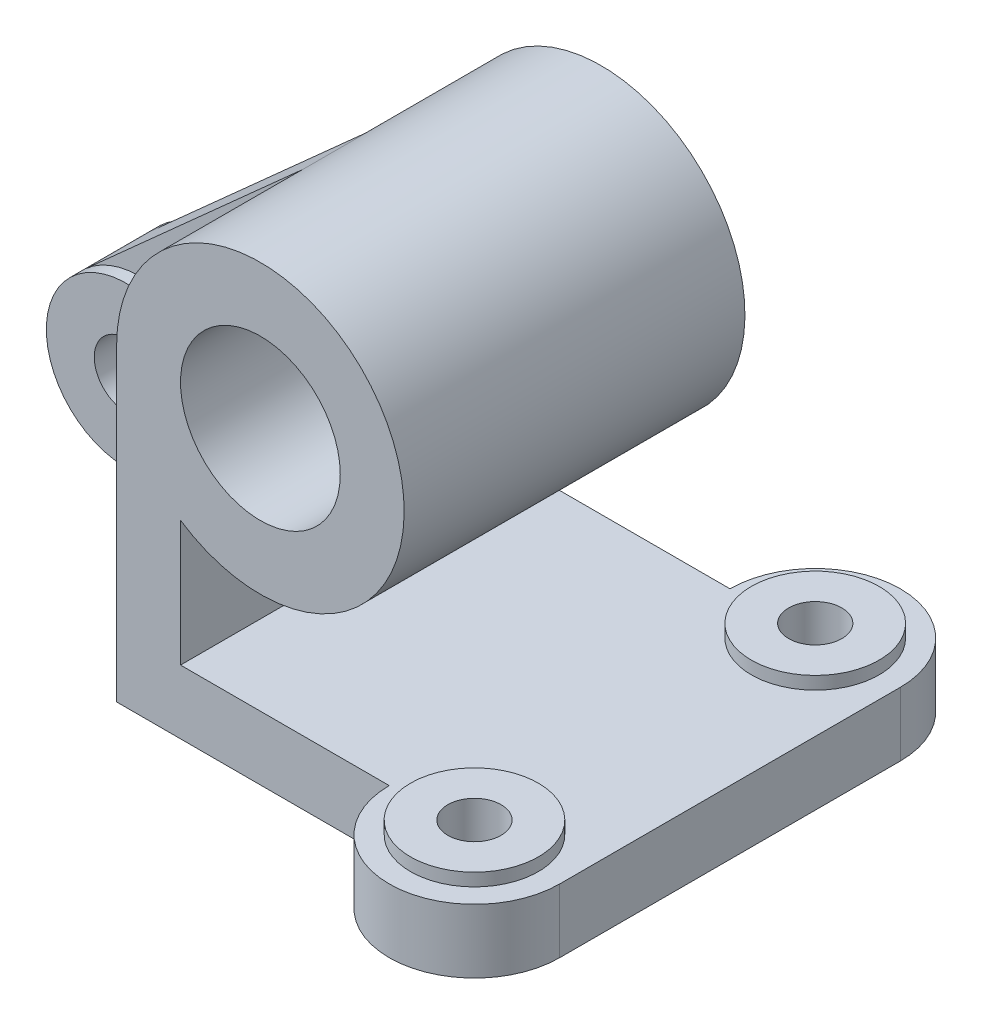
ISO-10303-21;
HEADER;
FILE_DESCRIPTION(('STEP AP214'),'2;1');
FILE_NAME('part.step','',(''),(''),'','','');
FILE_SCHEMA(('AUTOMOTIVE_DESIGN { 1 0 10303 214 1 1 1 1 }'));
ENDSEC;
DATA;
#1=APPLICATION_CONTEXT('core data for automotive mechanical design processes');
#2=APPLICATION_PROTOCOL_DEFINITION('international standard','automotive_design',2000,#1);
#3=PRODUCT_CONTEXT('',#1,'mechanical');
#4=PRODUCT('Part','Part','',(#3));
#5=PRODUCT_RELATED_PRODUCT_CATEGORY('part','',(#4));
#6=PRODUCT_DEFINITION_FORMATION('','',#4);
#7=PRODUCT_DEFINITION_CONTEXT('part definition',#1,'design');
#8=PRODUCT_DEFINITION('design','',#6,#7);
#9=PRODUCT_DEFINITION_SHAPE('','',#8);
#10=(LENGTH_UNIT() NAMED_UNIT(*) SI_UNIT(.MILLI.,.METRE.));
#11=(NAMED_UNIT(*) PLANE_ANGLE_UNIT() SI_UNIT($,.RADIAN.));
#12=(NAMED_UNIT(*) SI_UNIT($,.STERADIAN.) SOLID_ANGLE_UNIT());
#13=UNCERTAINTY_MEASURE_WITH_UNIT(LENGTH_MEASURE(1.E-05),#10,'distance_accuracy_value','');
#14=(GEOMETRIC_REPRESENTATION_CONTEXT(3) GLOBAL_UNCERTAINTY_ASSIGNED_CONTEXT((#13)) GLOBAL_UNIT_ASSIGNED_CONTEXT((#10,
#11,#12)) REPRESENTATION_CONTEXT('',''));
#15=CARTESIAN_POINT('',(0.,0.,0.));
#16=DIRECTION('',(0.,0.,1.));
#17=DIRECTION('',(1.,0.,0.));
#18=AXIS2_PLACEMENT_3D('',#15,#16,#17);
#19=CARTESIAN_POINT('',(0.,-144.998655552568,80.));
#20=DIRECTION('',(0.,1.,0.));
#21=DIRECTION('',(-1.,0.,0.));
#22=AXIS2_PLACEMENT_3D('',#19,#20,#21);
#23=PLANE('',#22);
#24=CARTESIAN_POINT('',(100.5,-144.998655552568,-80.));
#25=DIRECTION('',(0.,1.,0.));
#26=DIRECTION('',(-1.,0.,0.));
#27=AXIS2_PLACEMENT_3D('',#24,#25,#26);
#28=CIRCLE('',#27,12.5);
#29=CARTESIAN_POINT('',(88.,-144.998655552568,-80.));
#30=VERTEX_POINT('',#29);
#31=EDGE_CURVE('E351',#30,#30,#28,.T.);
#32=ORIENTED_EDGE('',*,*,#31,.T.);
#33=EDGE_LOOP('',(#32));
#34=FACE_BOUND('',#33,.T.);
#35=DIRECTION('',(1.,0.,0.));
#36=VECTOR('',#35,1.);
#37=CARTESIAN_POINT('',(0.,-144.998655552568,-80.));
#38=LINE('',#37,#36);
#39=CARTESIAN_POINT('',(-67.5,-144.998655552568,-80.));
#40=VERTEX_POINT('',#39);
#41=CARTESIAN_POINT('',(60.5,-144.998655552568,-80.));
#42=VERTEX_POINT('',#41);
#43=EDGE_CURVE('E173',#40,#42,#38,.T.);
#44=ORIENTED_EDGE('',*,*,#43,.T.);
#45=CARTESIAN_POINT('',(100.5,-144.998655552568,-80.));
#46=DIRECTION('',(0.,1.,0.));
#47=DIRECTION('',(-1.,0.,0.));
#48=AXIS2_PLACEMENT_3D('',#45,#46,#47);
#49=CIRCLE('',#48,40.);
#50=CARTESIAN_POINT('',(140.5,-144.998655552568,-80.));
#51=VERTEX_POINT('',#50);
#52=EDGE_CURVE('E160',#51,#42,#49,.T.);
#53=ORIENTED_EDGE('',*,*,#52,.F.);
#54=DIRECTION('',(0.,0.,1.));
#55=VECTOR('',#54,1.);
#56=CARTESIAN_POINT('',(140.5,-144.998655552568,80.));
#57=LINE('',#56,#55);
#58=CARTESIAN_POINT('',(140.5,-144.998655552568,80.));
#59=VERTEX_POINT('',#58);
#60=EDGE_CURVE('E154',#51,#59,#57,.T.);
#61=ORIENTED_EDGE('',*,*,#60,.T.);
#62=CARTESIAN_POINT('',(100.5,-144.998655552568,80.));
#63=DIRECTION('',(0.,1.,0.));
#64=DIRECTION('',(-1.,0.,0.));
#65=AXIS2_PLACEMENT_3D('',#62,#63,#64);
#66=CIRCLE('',#65,40.);
#67=CARTESIAN_POINT('',(60.5,-144.998655552568,80.));
#68=VERTEX_POINT('',#67);
#69=EDGE_CURVE('E316',#68,#59,#66,.T.);
#70=ORIENTED_EDGE('',*,*,#69,.F.);
#71=DIRECTION('',(1.,0.,0.));
#72=VECTOR('',#71,1.);
#73=CARTESIAN_POINT('',(0.,-144.998655552568,80.));
#74=LINE('',#73,#72);
#75=CARTESIAN_POINT('',(-67.5,-144.998655552568,80.));
#76=VERTEX_POINT('',#75);
#77=EDGE_CURVE('E69',#76,#68,#74,.T.);
#78=ORIENTED_EDGE('',*,*,#77,.F.);
#79=DIRECTION('',(0.,0.,-1.));
#80=VECTOR('',#79,1.);
#81=CARTESIAN_POINT('',(-67.5,-144.998655552568,80.));
#82=LINE('',#81,#80);
#83=CARTESIAN_POINT('',(-67.5,-144.998655552568,15.));
#84=VERTEX_POINT('',#83);
#85=EDGE_CURVE('E190',#76,#84,#82,.T.);
#86=ORIENTED_EDGE('',*,*,#85,.T.);
#87=DIRECTION('',(0.,0.,-1.));
#88=VECTOR('',#87,1.);
#89=CARTESIAN_POINT('',(-67.5,-144.998655552568,15.));
#90=LINE('',#89,#88);
#91=CARTESIAN_POINT('',(-67.5,-144.998655552568,-15.));
#92=VERTEX_POINT('',#91);
#93=EDGE_CURVE('E246',#84,#92,#90,.T.);
#94=ORIENTED_EDGE('',*,*,#93,.T.);
#95=EDGE_CURVE('E188',#92,#40,#82,.T.);
#96=ORIENTED_EDGE('',*,*,#95,.T.);
#97=EDGE_LOOP('',(#44,#53,#61,#70,#78,#86,#94,#96));
#98=FACE_BOUND('',#97,.T.);
#99=CARTESIAN_POINT('',(100.5,-144.998655552568,80.));
#100=DIRECTION('',(0.,1.,0.));
#101=DIRECTION('',(-1.,0.,0.));
#102=AXIS2_PLACEMENT_3D('',#99,#100,#101);
#103=CIRCLE('',#102,12.5);
#104=CARTESIAN_POINT('',(88.,-144.998655552568,80.));
#105=VERTEX_POINT('',#104);
#106=EDGE_CURVE('E339',#105,#105,#103,.T.);
#107=ORIENTED_EDGE('',*,*,#106,.T.);
#108=EDGE_LOOP('',(#107));
#109=FACE_BOUND('',#108,.T.);
#110=ADVANCED_FACE('F48',(#34,#98,#109),#23,.F.);
#111=CARTESIAN_POINT('',(0.,0.,80.));
#112=DIRECTION('',(0.,0.,1.));
#113=DIRECTION('',(1.,0.,0.));
#114=AXIS2_PLACEMENT_3D('',#111,#112,#113);
#115=PLANE('',#114);
#116=CARTESIAN_POINT('',(0.,0.,80.));
#117=DIRECTION('',(0.,0.,1.));
#118=DIRECTION('',(1.,0.,0.));
#119=AXIS2_PLACEMENT_3D('',#116,#117,#118);
#120=CIRCLE('',#119,37.5);
#121=CARTESIAN_POINT('',(37.5,0.,80.));
#122=VERTEX_POINT('',#121);
#123=EDGE_CURVE('E189',#122,#122,#120,.T.);
#124=ORIENTED_EDGE('',*,*,#123,.F.);
#125=EDGE_LOOP('',(#124));
#126=FACE_BOUND('',#125,.T.);
#127=ORIENTED_EDGE('',*,*,#77,.T.);
#128=DIRECTION('',(0.,-1.,0.));
#129=VECTOR('',#128,1.);
#130=CARTESIAN_POINT('',(60.5,-114.998655552568,80.));
#131=LINE('',#130,#129);
#132=CARTESIAN_POINT('',(60.5,-114.998655552568,80.));
#133=VERTEX_POINT('',#132);
#134=EDGE_CURVE('E64',#133,#68,#131,.T.);
#135=ORIENTED_EDGE('',*,*,#134,.F.);
#136=DIRECTION('',(-1.,0.,0.));
#137=VECTOR('',#136,1.);
#138=CARTESIAN_POINT('',(0.,-114.998655552568,80.));
#139=LINE('',#138,#137);
#140=CARTESIAN_POINT('',(-37.5,-114.998655552568,80.));
#141=VERTEX_POINT('',#140);
#142=EDGE_CURVE('E229',#133,#141,#139,.T.);
#143=ORIENTED_EDGE('',*,*,#142,.T.);
#144=DIRECTION('',(0.,1.,0.));
#145=VECTOR('',#144,1.);
#146=CARTESIAN_POINT('',(-37.5,0.,80.));
#147=LINE('',#146,#145);
#148=CARTESIAN_POINT('',(-37.5,-56.1248608016091,80.));
#149=VERTEX_POINT('',#148);
#150=EDGE_CURVE('E179',#141,#149,#147,.T.);
#151=ORIENTED_EDGE('',*,*,#150,.T.);
#152=CARTESIAN_POINT('',(0.,0.,80.));
#153=DIRECTION('',(0.,0.,1.));
#154=DIRECTION('',(1.,0.,0.));
#155=AXIS2_PLACEMENT_3D('',#152,#153,#154);
#156=CIRCLE('',#155,67.5);
#157=CARTESIAN_POINT('',(-67.5,0.,80.));
#158=VERTEX_POINT('',#157);
#159=EDGE_CURVE('E237',#149,#158,#156,.T.);
#160=ORIENTED_EDGE('',*,*,#159,.T.);
#161=DIRECTION('',(0.,-1.,0.));
#162=VECTOR('',#161,1.);
#163=CARTESIAN_POINT('',(-67.5,0.,80.));
#164=LINE('',#163,#162);
#165=EDGE_CURVE('E234',#158,#76,#164,.T.);
#166=ORIENTED_EDGE('',*,*,#165,.T.);
#167=EDGE_LOOP('',(#127,#135,#143,#151,#160,#166));
#168=FACE_BOUND('',#167,.T.);
#169=ADVANCED_FACE('F374',(#126,#168),#115,.T.);
#170=CARTESIAN_POINT('',(0.,0.,-80.));
#171=DIRECTION('',(0.,0.,1.));
#172=DIRECTION('',(1.,0.,0.));
#173=AXIS2_PLACEMENT_3D('',#170,#171,#172);
#174=PLANE('',#173);
#175=CARTESIAN_POINT('',(0.,0.,-80.));
#176=DIRECTION('',(0.,0.,1.));
#177=DIRECTION('',(1.,0.,0.));
#178=AXIS2_PLACEMENT_3D('',#175,#176,#177);
#179=CIRCLE('',#178,37.5);
#180=CARTESIAN_POINT('',(37.5,0.,-80.));
#181=VERTEX_POINT('',#180);
#182=EDGE_CURVE('E172',#181,#181,#179,.T.);
#183=ORIENTED_EDGE('',*,*,#182,.T.);
#184=EDGE_LOOP('',(#183));
#185=FACE_BOUND('',#184,.T.);
#186=DIRECTION('',(0.,-1.,0.));
#187=VECTOR('',#186,1.);
#188=CARTESIAN_POINT('',(60.5,-114.998655552568,-80.));
#189=LINE('',#188,#187);
#190=CARTESIAN_POINT('',(60.5,-114.998655552568,-80.));
#191=VERTEX_POINT('',#190);
#192=EDGE_CURVE('E157',#191,#42,#189,.T.);
#193=ORIENTED_EDGE('',*,*,#192,.T.);
#194=ORIENTED_EDGE('',*,*,#43,.F.);
#195=DIRECTION('',(0.,-1.,0.));
#196=VECTOR('',#195,1.);
#197=CARTESIAN_POINT('',(-67.5,0.,-80.));
#198=LINE('',#197,#196);
#199=CARTESIAN_POINT('',(-67.5,0.,-80.));
#200=VERTEX_POINT('',#199);
#201=EDGE_CURVE('E181',#200,#40,#198,.T.);
#202=ORIENTED_EDGE('',*,*,#201,.F.);
#203=CARTESIAN_POINT('',(0.,0.,-80.));
#204=DIRECTION('',(0.,0.,1.));
#205=DIRECTION('',(1.,0.,0.));
#206=AXIS2_PLACEMENT_3D('',#203,#204,#205);
#207=CIRCLE('',#206,67.5);
#208=CARTESIAN_POINT('',(-37.5,-56.1248608016091,-80.));
#209=VERTEX_POINT('',#208);
#210=EDGE_CURVE('E214',#209,#200,#207,.T.);
#211=ORIENTED_EDGE('',*,*,#210,.F.);
#212=DIRECTION('',(0.,1.,0.));
#213=VECTOR('',#212,1.);
#214=CARTESIAN_POINT('',(-37.5,0.,-80.));
#215=LINE('',#214,#213);
#216=CARTESIAN_POINT('',(-37.5,-114.998655552568,-80.));
#217=VERTEX_POINT('',#216);
#218=EDGE_CURVE('E170',#217,#209,#215,.T.);
#219=ORIENTED_EDGE('',*,*,#218,.F.);
#220=DIRECTION('',(-1.,0.,0.));
#221=VECTOR('',#220,1.);
#222=CARTESIAN_POINT('',(0.,-114.998655552568,-80.));
#223=LINE('',#222,#221);
#224=EDGE_CURVE('E147',#191,#217,#223,.T.);
#225=ORIENTED_EDGE('',*,*,#224,.F.);
#226=EDGE_LOOP('',(#193,#194,#202,#211,#219,#225));
#227=FACE_BOUND('',#226,.T.);
#228=ADVANCED_FACE('F168',(#185,#227),#174,.F.);
#229=CARTESIAN_POINT('',(-67.5,0.,80.));
#230=DIRECTION('',(1.,0.,0.));
#231=DIRECTION('',(0.,1.,0.));
#232=AXIS2_PLACEMENT_3D('',#229,#230,#231);
#233=PLANE('',#232);
#234=DIRECTION('',(0.,-1.,0.));
#235=VECTOR('',#234,1.);
#236=CARTESIAN_POINT('',(-67.5,0.,-15.));
#237=LINE('',#236,#235);
#238=CARTESIAN_POINT('',(-67.5,0.,-15.));
#239=VERTEX_POINT('',#238);
#240=EDGE_CURVE('E211',#239,#92,#237,.T.);
#241=ORIENTED_EDGE('',*,*,#240,.F.);
#242=DIRECTION('',(0.,0.,-1.));
#243=VECTOR('',#242,1.);
#244=CARTESIAN_POINT('',(-67.5,0.,80.));
#245=LINE('',#244,#243);
#246=EDGE_CURVE('E193',#239,#200,#245,.T.);
#247=ORIENTED_EDGE('',*,*,#246,.T.);
#248=ORIENTED_EDGE('',*,*,#201,.T.);
#249=ORIENTED_EDGE('',*,*,#95,.F.);
#250=EDGE_LOOP('',(#241,#247,#248,#249));
#251=FACE_BOUND('',#250,.T.);
#252=ADVANCED_FACE('F208',(#251),#233,.F.);
#253=CARTESIAN_POINT('',(-37.5,0.,80.));
#254=DIRECTION('',(-1.,0.,0.));
#255=DIRECTION('',(0.,-1.,0.));
#256=AXIS2_PLACEMENT_3D('',#253,#254,#255);
#257=PLANE('',#256);
#258=ORIENTED_EDGE('',*,*,#218,.T.);
#259=DIRECTION('',(0.,0.,-1.));
#260=VECTOR('',#259,1.);
#261=CARTESIAN_POINT('',(-37.5,-56.1248608016091,80.));
#262=LINE('',#261,#260);
#263=EDGE_CURVE('E12',#149,#209,#262,.T.);
#264=ORIENTED_EDGE('',*,*,#263,.F.);
#265=ORIENTED_EDGE('',*,*,#150,.F.);
#266=DIRECTION('',(0.,0.,-1.));
#267=VECTOR('',#266,1.);
#268=CARTESIAN_POINT('',(-37.5,-114.998655552568,80.));
#269=LINE('',#268,#267);
#270=EDGE_CURVE('E185',#141,#217,#269,.T.);
#271=ORIENTED_EDGE('',*,*,#270,.T.);
#272=EDGE_LOOP('',(#258,#264,#265,#271));
#273=FACE_BOUND('',#272,.T.);
#274=ADVANCED_FACE('F50',(#273),#257,.F.);
#275=CARTESIAN_POINT('',(0.,0.,80.));
#276=DIRECTION('',(0.,0.,-1.));
#277=DIRECTION('',(-1.,0.,0.));
#278=AXIS2_PLACEMENT_3D('',#275,#276,#277);
#279=CYLINDRICAL_SURFACE('',#278,67.5);
#280=DIRECTION('',(0.,0.,-1.));
#281=VECTOR('',#280,1.);
#282=CARTESIAN_POINT('',(-45.0349803120584,50.2802202490453,15.));
#283=LINE('',#282,#281);
#284=CARTESIAN_POINT('',(-45.0349803120584,50.2802202490453,15.));
#285=VERTEX_POINT('',#284);
#286=CARTESIAN_POINT('',(-45.0349803120584,50.2802202490453,-15.));
#287=VERTEX_POINT('',#286);
#288=EDGE_CURVE('E250',#285,#287,#283,.T.);
#289=ORIENTED_EDGE('',*,*,#288,.F.);
#290=CARTESIAN_POINT('',(0.,0.,15.));
#291=DIRECTION('',(0.,0.,1.));
#292=DIRECTION('',(1.,0.,0.));
#293=AXIS2_PLACEMENT_3D('',#290,#291,#292);
#294=CIRCLE('',#293,67.5);
#295=CARTESIAN_POINT('',(-67.5,0.,15.));
#296=VERTEX_POINT('',#295);
#297=EDGE_CURVE('E279',#285,#296,#294,.T.);
#298=ORIENTED_EDGE('',*,*,#297,.T.);
#299=EDGE_CURVE('E57',#158,#296,#245,.T.);
#300=ORIENTED_EDGE('',*,*,#299,.F.);
#301=ORIENTED_EDGE('',*,*,#159,.F.);
#302=ORIENTED_EDGE('',*,*,#263,.T.);
#303=ORIENTED_EDGE('',*,*,#210,.T.);
#304=ORIENTED_EDGE('',*,*,#246,.F.);
#305=CARTESIAN_POINT('',(0.,0.,-15.));
#306=DIRECTION('',(0.,0.,1.));
#307=DIRECTION('',(1.,0.,0.));
#308=AXIS2_PLACEMENT_3D('',#305,#306,#307);
#309=CIRCLE('',#308,67.5);
#310=EDGE_CURVE('E262',#287,#239,#309,.T.);
#311=ORIENTED_EDGE('',*,*,#310,.F.);
#312=EDGE_LOOP('',(#289,#298,#300,#301,#302,#303,#304,#311));
#313=FACE_BOUND('',#312,.T.);
#314=ADVANCED_FACE('F216',(#313),#279,.T.);
#315=ORIENTED_EDGE('',*,*,#299,.T.);
#316=DIRECTION('',(0.,-1.,0.));
#317=VECTOR('',#316,1.);
#318=CARTESIAN_POINT('',(-67.5,0.,15.));
#319=LINE('',#318,#317);
#320=EDGE_CURVE('E283',#296,#84,#319,.T.);
#321=ORIENTED_EDGE('',*,*,#320,.T.);
#322=ORIENTED_EDGE('',*,*,#85,.F.);
#323=ORIENTED_EDGE('',*,*,#165,.F.);
#324=EDGE_LOOP('',(#315,#321,#322,#323));
#325=FACE_BOUND('',#324,.T.);
#326=ADVANCED_FACE('F386',(#325),#233,.F.);
#327=CARTESIAN_POINT('',(0.,-114.998655552568,80.));
#328=DIRECTION('',(0.,-1.,0.));
#329=DIRECTION('',(1.,0.,0.));
#330=AXIS2_PLACEMENT_3D('',#327,#328,#329);
#331=PLANE('',#330);
#332=CARTESIAN_POINT('',(100.5,-114.998655552568,-80.));
#333=DIRECTION('',(0.,1.,0.));
#334=DIRECTION('',(-1.,0.,0.));
#335=AXIS2_PLACEMENT_3D('',#332,#333,#334);
#336=CIRCLE('',#335,30.);
#337=CARTESIAN_POINT('',(70.5,-114.998655552568,-80.));
#338=VERTEX_POINT('',#337);
#339=EDGE_CURVE('E153',#338,#338,#336,.T.);
#340=ORIENTED_EDGE('',*,*,#339,.F.);
#341=EDGE_LOOP('',(#340));
#342=FACE_BOUND('',#341,.T.);
#343=CARTESIAN_POINT('',(100.5,-114.998655552568,80.));
#344=DIRECTION('',(0.,1.,0.));
#345=DIRECTION('',(-1.,0.,0.));
#346=AXIS2_PLACEMENT_3D('',#343,#344,#345);
#347=CIRCLE('',#346,30.);
#348=CARTESIAN_POINT('',(70.5,-114.998655552568,80.));
#349=VERTEX_POINT('',#348);
#350=EDGE_CURVE('E328',#349,#349,#347,.T.);
#351=ORIENTED_EDGE('',*,*,#350,.F.);
#352=EDGE_LOOP('',(#351));
#353=FACE_BOUND('',#352,.T.);
#354=ORIENTED_EDGE('',*,*,#142,.F.);
#355=CARTESIAN_POINT('',(100.5,-114.998655552568,80.));
#356=DIRECTION('',(0.,1.,0.));
#357=DIRECTION('',(-1.,0.,0.));
#358=AXIS2_PLACEMENT_3D('',#355,#356,#357);
#359=CIRCLE('',#358,40.);
#360=CARTESIAN_POINT('',(140.5,-114.998655552568,80.));
#361=VERTEX_POINT('',#360);
#362=EDGE_CURVE('E325',#133,#361,#359,.T.);
#363=ORIENTED_EDGE('',*,*,#362,.T.);
#364=DIRECTION('',(0.,0.,1.));
#365=VECTOR('',#364,1.);
#366=CARTESIAN_POINT('',(140.5,-114.998655552568,80.));
#367=LINE('',#366,#365);
#368=CARTESIAN_POINT('',(140.5,-114.998655552568,-80.));
#369=VERTEX_POINT('',#368);
#370=EDGE_CURVE('E150',#369,#361,#367,.T.);
#371=ORIENTED_EDGE('',*,*,#370,.F.);
#372=CARTESIAN_POINT('',(100.5,-114.998655552568,-80.));
#373=DIRECTION('',(0.,1.,0.));
#374=DIRECTION('',(-1.,0.,0.));
#375=AXIS2_PLACEMENT_3D('',#372,#373,#374);
#376=CIRCLE('',#375,40.);
#377=EDGE_CURVE('E142',#369,#191,#376,.T.);
#378=ORIENTED_EDGE('',*,*,#377,.T.);
#379=ORIENTED_EDGE('',*,*,#224,.T.);
#380=ORIENTED_EDGE('',*,*,#270,.F.);
#381=EDGE_LOOP('',(#354,#363,#371,#378,#379,#380));
#382=FACE_BOUND('',#381,.T.);
#383=ADVANCED_FACE('F144',(#342,#353,#382),#331,.F.);
#384=CARTESIAN_POINT('',(0.,0.,80.));
#385=DIRECTION('',(0.,0.,-1.));
#386=DIRECTION('',(-1.,0.,0.));
#387=AXIS2_PLACEMENT_3D('',#384,#385,#386);
#388=CYLINDRICAL_SURFACE('',#387,37.5);
#389=ORIENTED_EDGE('',*,*,#123,.T.);
#390=EDGE_LOOP('',(#389));
#391=FACE_BOUND('',#390,.T.);
#392=ORIENTED_EDGE('',*,*,#182,.F.);
#393=EDGE_LOOP('',(#392));
#394=FACE_BOUND('',#393,.T.);
#395=ADVANCED_FACE('F466',(#391,#394),#388,.F.);
#396=CARTESIAN_POINT('',(-81.2836413694165,-136.809264537074,15.));
#397=DIRECTION('',(0.510785627799753,0.859708114672191,0.));
#398=DIRECTION('',(-0.859708114672191,0.510785627799753,0.));
#399=AXIS2_PLACEMENT_3D('',#396,#397,#398);
#400=PLANE('',#399);
#401=DIRECTION('',(0.859708114672191,-0.510785627799753,0.));
#402=VECTOR('',#401,1.);
#403=CARTESIAN_POINT('',(-81.2836413694165,-136.809264537074,-15.));
#404=LINE('',#403,#402);
#405=CARTESIAN_POINT('',(-141.154461042491,-101.237709852775,-15.));
#406=VERTEX_POINT('',#405);
#407=EDGE_CURVE('E267',#406,#92,#404,.T.);
#408=ORIENTED_EDGE('',*,*,#407,.T.);
#409=ORIENTED_EDGE('',*,*,#93,.F.);
#410=DIRECTION('',(0.859708114672191,-0.510785627799753,0.));
#411=VECTOR('',#410,1.);
#412=CARTESIAN_POINT('',(-81.2836413694165,-136.809264537074,15.));
#413=LINE('',#412,#411);
#414=CARTESIAN_POINT('',(-141.154461042491,-101.237709852775,15.));
#415=VERTEX_POINT('',#414);
#416=EDGE_CURVE('E286',#415,#84,#413,.T.);
#417=ORIENTED_EDGE('',*,*,#416,.F.);
#418=DIRECTION('',(0.,0.,-1.));
#419=VECTOR('',#418,1.);
#420=CARTESIAN_POINT('',(-141.154461042491,-101.237709852775,15.));
#421=LINE('',#420,#419);
#422=EDGE_CURVE('E225',#415,#406,#421,.T.);
#423=ORIENTED_EDGE('',*,*,#422,.T.);
#424=EDGE_LOOP('',(#408,#409,#417,#423));
#425=FACE_BOUND('',#424,.T.);
#426=ADVANCED_FACE('F421',(#425),#400,.F.);
#427=CARTESIAN_POINT('',(-45.0349803120584,50.2802202490453,15.));
#428=DIRECTION('',(-0.667184893511977,0.744892151837709,0.));
#429=DIRECTION('',(-0.744892151837709,-0.667184893511977,0.));
#430=AXIS2_PLACEMENT_3D('',#427,#428,#429);
#431=PLANE('',#430);
#432=DIRECTION('',(0.744892151837709,0.667184893511977,0.));
#433=VECTOR('',#432,1.);
#434=CARTESIAN_POINT('',(-45.0349803120584,50.2802202490453,-15.));
#435=LINE('',#434,#433);
#436=CARTESIAN_POINT('',(-147.019433506699,-41.0651998586538,-15.));
#437=VERTEX_POINT('',#436);
#438=EDGE_CURVE('E257',#437,#287,#435,.T.);
#439=ORIENTED_EDGE('',*,*,#438,.F.);
#440=DIRECTION('',(0.,0.,-1.));
#441=VECTOR('',#440,1.);
#442=CARTESIAN_POINT('',(-147.019433506699,-41.0651998586538,15.));
#443=LINE('',#442,#441);
#444=CARTESIAN_POINT('',(-147.019433506699,-41.0651998586538,15.));
#445=VERTEX_POINT('',#444);
#446=EDGE_CURVE('E253',#445,#437,#443,.T.);
#447=ORIENTED_EDGE('',*,*,#446,.F.);
#448=DIRECTION('',(0.744892151837709,0.667184893511977,0.));
#449=VECTOR('',#448,1.);
#450=CARTESIAN_POINT('',(-45.0349803120584,50.2802202490453,15.));
#451=LINE('',#450,#449);
#452=EDGE_CURVE('E256',#445,#285,#451,.T.);
#453=ORIENTED_EDGE('',*,*,#452,.T.);
#454=ORIENTED_EDGE('',*,*,#288,.T.);
#455=EDGE_LOOP('',(#439,#447,#453,#454));
#456=FACE_BOUND('',#455,.T.);
#457=ADVANCED_FACE('F429',(#456),#431,.T.);
#458=CARTESIAN_POINT('',(0.,0.,15.));
#459=DIRECTION('',(0.,0.,1.));
#460=DIRECTION('',(1.,0.,0.));
#461=AXIS2_PLACEMENT_3D('',#458,#459,#460);
#462=PLANE('',#461);
#463=CARTESIAN_POINT('',(-122.,-68.9986555525679,15.));
#464=DIRECTION('',(0.,0.,1.));
#465=DIRECTION('',(1.,0.,0.));
#466=AXIS2_PLACEMENT_3D('',#463,#464,#465);
#467=CIRCLE('',#466,37.5);
#468=EDGE_CURVE('E261',#415,#445,#467,.T.);
#469=ORIENTED_EDGE('',*,*,#468,.F.);
#470=ORIENTED_EDGE('',*,*,#416,.T.);
#471=ORIENTED_EDGE('',*,*,#320,.F.);
#472=ORIENTED_EDGE('',*,*,#297,.F.);
#473=ORIENTED_EDGE('',*,*,#452,.F.);
#474=EDGE_LOOP('',(#469,#470,#471,#472,#473));
#475=FACE_BOUND('',#474,.T.);
#476=ADVANCED_FACE('F425',(#475),#462,.T.);
#477=CARTESIAN_POINT('',(0.,0.,-15.));
#478=DIRECTION('',(0.,0.,1.));
#479=DIRECTION('',(1.,0.,0.));
#480=AXIS2_PLACEMENT_3D('',#477,#478,#479);
#481=PLANE('',#480);
#482=CARTESIAN_POINT('',(-122.,-68.9986555525679,-15.));
#483=DIRECTION('',(0.,0.,1.));
#484=DIRECTION('',(1.,0.,0.));
#485=AXIS2_PLACEMENT_3D('',#482,#483,#484);
#486=CIRCLE('',#485,37.5);
#487=EDGE_CURVE('E271',#406,#437,#486,.T.);
#488=ORIENTED_EDGE('',*,*,#487,.T.);
#489=ORIENTED_EDGE('',*,*,#438,.T.);
#490=ORIENTED_EDGE('',*,*,#310,.T.);
#491=ORIENTED_EDGE('',*,*,#240,.T.);
#492=ORIENTED_EDGE('',*,*,#407,.F.);
#493=EDGE_LOOP('',(#488,#489,#490,#491,#492));
#494=FACE_BOUND('',#493,.T.);
#495=ADVANCED_FACE('F432',(#494),#481,.F.);
#496=CARTESIAN_POINT('',(-122.,-68.9986555525679,21.));
#497=DIRECTION('',(0.,0.,-1.));
#498=DIRECTION('',(-1.,0.,0.));
#499=AXIS2_PLACEMENT_3D('',#496,#497,#498);
#500=CYLINDRICAL_SURFACE('',#499,15.);
#501=CARTESIAN_POINT('',(-122.,-68.9986555525679,21.));
#502=DIRECTION('',(0.,0.,1.));
#503=DIRECTION('',(1.,0.,0.));
#504=AXIS2_PLACEMENT_3D('',#501,#502,#503);
#505=CIRCLE('',#504,15.);
#506=CARTESIAN_POINT('',(-137.,-68.9986555525679,21.));
#507=VERTEX_POINT('',#506);
#508=EDGE_CURVE('E295',#507,#507,#505,.T.);
#509=CARTESIAN_POINT('',(-122.,-68.9986555525679,-21.));
#510=DIRECTION('',(0.,0.,1.));
#511=DIRECTION('',(1.,0.,0.));
#512=AXIS2_PLACEMENT_3D('',#509,#510,#511);
#513=CIRCLE('',#512,15.);
#514=CARTESIAN_POINT('',(-137.,-68.9986555525679,-21.));
#515=VERTEX_POINT('',#514);
#516=EDGE_CURVE('E165',#515,#515,#513,.T.);
#517=CARTESIAN_POINT('',(-137.,-68.9986555525679,21.));
#518=CARTESIAN_POINT('',(-137.,-68.9986555525679,20.5625));
#519=CARTESIAN_POINT('',(-137.,-68.9986555525679,20.125));
#520=CARTESIAN_POINT('',(-137.,-68.9986555525679,19.25));
#521=CARTESIAN_POINT('',(-137.,-68.9986555525679,18.8125));
#522=CARTESIAN_POINT('',(-137.,-68.9986555525679,17.9375));
#523=CARTESIAN_POINT('',(-137.,-68.9986555525679,17.5));
#524=CARTESIAN_POINT('',(-137.,-68.9986555525679,16.625));
#525=CARTESIAN_POINT('',(-137.,-68.9986555525679,16.1875));
#526=CARTESIAN_POINT('',(-137.,-68.9986555525679,15.3125));
#527=CARTESIAN_POINT('',(-137.,-68.9986555525679,14.875));
#528=CARTESIAN_POINT('',(-137.,-68.9986555525679,14.));
#529=CARTESIAN_POINT('',(-137.,-68.9986555525679,13.5625));
#530=CARTESIAN_POINT('',(-137.,-68.9986555525679,12.6875));
#531=CARTESIAN_POINT('',(-137.,-68.9986555525679,12.25));
#532=CARTESIAN_POINT('',(-137.,-68.9986555525679,11.375));
#533=CARTESIAN_POINT('',(-137.,-68.9986555525679,10.9375));
#534=CARTESIAN_POINT('',(-137.,-68.9986555525679,10.0625));
#535=CARTESIAN_POINT('',(-137.,-68.9986555525679,9.625));
#536=CARTESIAN_POINT('',(-137.,-68.9986555525679,8.75));
#537=CARTESIAN_POINT('',(-137.,-68.9986555525679,8.3125));
#538=CARTESIAN_POINT('',(-137.,-68.9986555525679,7.4375));
#539=CARTESIAN_POINT('',(-137.,-68.9986555525679,7.));
#540=CARTESIAN_POINT('',(-137.,-68.9986555525679,6.125));
#541=CARTESIAN_POINT('',(-137.,-68.9986555525679,5.6875));
#542=CARTESIAN_POINT('',(-137.,-68.9986555525679,4.8125));
#543=CARTESIAN_POINT('',(-137.,-68.9986555525679,4.375));
#544=CARTESIAN_POINT('',(-137.,-68.9986555525679,3.5));
#545=CARTESIAN_POINT('',(-137.,-68.9986555525679,3.0625));
#546=CARTESIAN_POINT('',(-137.,-68.9986555525679,2.1875));
#547=CARTESIAN_POINT('',(-137.,-68.9986555525679,1.75));
#548=CARTESIAN_POINT('',(-137.,-68.9986555525679,0.874999999999997));
#549=CARTESIAN_POINT('',(-137.,-68.9986555525679,0.437499999999997));
#550=CARTESIAN_POINT('',(-137.,-68.9986555525679,-0.437500000000004));
#551=CARTESIAN_POINT('',(-137.,-68.9986555525679,-0.875000000000004));
#552=CARTESIAN_POINT('',(-137.,-68.9986555525679,-1.75000000000001));
#553=CARTESIAN_POINT('',(-137.,-68.9986555525679,-2.18750000000001));
#554=CARTESIAN_POINT('',(-137.,-68.9986555525679,-3.0625));
#555=CARTESIAN_POINT('',(-137.,-68.9986555525679,-3.5));
#556=CARTESIAN_POINT('',(-137.,-68.9986555525679,-4.375));
#557=CARTESIAN_POINT('',(-137.,-68.9986555525679,-4.8125));
#558=CARTESIAN_POINT('',(-137.,-68.9986555525679,-5.68750000000001));
#559=CARTESIAN_POINT('',(-137.,-68.9986555525679,-6.12500000000001));
#560=CARTESIAN_POINT('',(-137.,-68.9986555525679,-7.00000000000001));
#561=CARTESIAN_POINT('',(-137.,-68.9986555525679,-7.4375));
#562=CARTESIAN_POINT('',(-137.,-68.9986555525679,-8.3125));
#563=CARTESIAN_POINT('',(-137.,-68.9986555525679,-8.75));
#564=CARTESIAN_POINT('',(-137.,-68.9986555525679,-9.625));
#565=CARTESIAN_POINT('',(-137.,-68.9986555525679,-10.0625));
#566=CARTESIAN_POINT('',(-137.,-68.9986555525679,-10.9375));
#567=CARTESIAN_POINT('',(-137.,-68.9986555525679,-11.375));
#568=CARTESIAN_POINT('',(-137.,-68.9986555525679,-12.25));
#569=CARTESIAN_POINT('',(-137.,-68.9986555525679,-12.6875));
#570=CARTESIAN_POINT('',(-137.,-68.9986555525679,-13.5625));
#571=CARTESIAN_POINT('',(-137.,-68.9986555525679,-14.));
#572=CARTESIAN_POINT('',(-137.,-68.9986555525679,-14.875));
#573=CARTESIAN_POINT('',(-137.,-68.9986555525679,-15.3125));
#574=CARTESIAN_POINT('',(-137.,-68.9986555525679,-16.1875));
#575=CARTESIAN_POINT('',(-137.,-68.9986555525679,-16.625));
#576=CARTESIAN_POINT('',(-137.,-68.9986555525679,-17.5));
#577=CARTESIAN_POINT('',(-137.,-68.9986555525679,-17.9375));
#578=CARTESIAN_POINT('',(-137.,-68.9986555525679,-18.8125));
#579=CARTESIAN_POINT('',(-137.,-68.9986555525679,-19.25));
#580=CARTESIAN_POINT('',(-137.,-68.9986555525679,-20.125));
#581=CARTESIAN_POINT('',(-137.,-68.9986555525679,-20.5625));
#582=CARTESIAN_POINT('',(-137.,-68.9986555525679,-21.));
#583=B_SPLINE_CURVE_WITH_KNOTS('',3,(#517,#518,#519,#520,#521,#522,#523,#524,#525,#526,#527,
#528,#529,#530,#531,#532,#533,#534,#535,#536,#537,#538,#539,#540,#541,#542,#543,#544,#545,#546,
#547,#548,#549,#550,#551,#552,#553,#554,#555,#556,#557,#558,#559,#560,#561,#562,#563,#564,#565,
#566,#567,#568,#569,#570,#571,#572,#573,#574,#575,#576,#577,#578,#579,#580,#581,#582),
.UNSPECIFIED.,.F.,.F.,(4,2,2,2,2,2,2,2,2,2,2,2,2,2,2,2,2,2,2,2,2,2,2,2,2,2,2,2,2,2,2,2,4),(0.,
1.3125,2.625,3.9375,5.25,6.5625,7.875,9.1875,10.5,11.8125,13.125,14.4375,15.75,17.0625,18.375,
19.6875,21.,22.3125,23.625,24.9375,26.25,27.5625,28.875,30.1875,31.5,32.8125,34.125,35.4375,
36.75,38.0625,39.375,40.6875,42.),.UNSPECIFIED.);
#584=EDGE_CURVE('BSEAM438',#507,#515,#583,.T.);
#585=ORIENTED_EDGE('',*,*,#508,.T.);
#586=ORIENTED_EDGE('',*,*,#516,.F.);
#587=ORIENTED_EDGE('',*,*,#584,.T.);
#588=ORIENTED_EDGE('',*,*,#584,.F.);
#589=EDGE_LOOP('',(#585,#587,#586,#588));
#590=FACE_BOUND('',#589,.T.);
#591=ADVANCED_FACE('F438',(#590),#500,.F.);
#592=CARTESIAN_POINT('',(-122.,-68.9986555525679,21.));
#593=DIRECTION('',(0.,0.,-1.));
#594=DIRECTION('',(-1.,0.,0.));
#595=AXIS2_PLACEMENT_3D('',#592,#593,#594);
#596=CYLINDRICAL_SURFACE('',#595,37.5);
#597=ORIENTED_EDGE('',*,*,#468,.T.);
#598=ORIENTED_EDGE('',*,*,#446,.T.);
#599=ORIENTED_EDGE('',*,*,#487,.F.);
#600=ORIENTED_EDGE('',*,*,#422,.F.);
#601=EDGE_LOOP('',(#597,#598,#599,#600));
#602=FACE_BOUND('',#601,.T.);
#603=CARTESIAN_POINT('',(-122.,-68.9986555525679,21.));
#604=DIRECTION('',(0.,0.,1.));
#605=DIRECTION('',(1.,0.,0.));
#606=AXIS2_PLACEMENT_3D('',#603,#604,#605);
#607=CIRCLE('',#606,37.5);
#608=CARTESIAN_POINT('',(-84.5,-68.9986555525679,21.));
#609=VERTEX_POINT('',#608);
#610=EDGE_CURVE('E275',#609,#609,#607,.T.);
#611=ORIENTED_EDGE('',*,*,#610,.F.);
#612=EDGE_LOOP('',(#611));
#613=FACE_BOUND('',#612,.T.);
#614=CARTESIAN_POINT('',(-122.,-68.9986555525679,-21.));
#615=DIRECTION('',(0.,0.,1.));
#616=DIRECTION('',(1.,0.,0.));
#617=AXIS2_PLACEMENT_3D('',#614,#615,#616);
#618=CIRCLE('',#617,37.5);
#619=CARTESIAN_POINT('',(-84.5,-68.9986555525679,-21.));
#620=VERTEX_POINT('',#619);
#621=EDGE_CURVE('E291',#620,#620,#618,.T.);
#622=ORIENTED_EDGE('',*,*,#621,.T.);
#623=EDGE_LOOP('',(#622));
#624=FACE_BOUND('',#623,.T.);
#625=ADVANCED_FACE('F434',(#602,#613,#624),#596,.T.);
#626=CARTESIAN_POINT('',(0.,0.,21.));
#627=DIRECTION('',(0.,0.,1.));
#628=DIRECTION('',(1.,0.,0.));
#629=AXIS2_PLACEMENT_3D('',#626,#627,#628);
#630=PLANE('',#629);
#631=ORIENTED_EDGE('',*,*,#508,.F.);
#632=EDGE_LOOP('',(#631));
#633=FACE_BOUND('',#632,.T.);
#634=ORIENTED_EDGE('',*,*,#610,.T.);
#635=EDGE_LOOP('',(#634));
#636=FACE_BOUND('',#635,.T.);
#637=ADVANCED_FACE('F437',(#633,#636),#630,.T.);
#638=CARTESIAN_POINT('',(0.,0.,-21.));
#639=DIRECTION('',(0.,0.,1.));
#640=DIRECTION('',(1.,0.,0.));
#641=AXIS2_PLACEMENT_3D('',#638,#639,#640);
#642=PLANE('',#641);
#643=ORIENTED_EDGE('',*,*,#516,.T.);
#644=EDGE_LOOP('',(#643));
#645=FACE_BOUND('',#644,.T.);
#646=ORIENTED_EDGE('',*,*,#621,.F.);
#647=EDGE_LOOP('',(#646));
#648=FACE_BOUND('',#647,.T.);
#649=ADVANCED_FACE('F444',(#645,#648),#642,.F.);
#650=CARTESIAN_POINT('',(100.5,-114.998655552568,-80.));
#651=DIRECTION('',(0.,-1.,0.));
#652=DIRECTION('',(1.,0.,0.));
#653=AXIS2_PLACEMENT_3D('',#650,#651,#652);
#654=CYLINDRICAL_SURFACE('',#653,40.);
#655=ORIENTED_EDGE('',*,*,#52,.T.);
#656=ORIENTED_EDGE('',*,*,#192,.F.);
#657=ORIENTED_EDGE('',*,*,#377,.F.);
#658=DIRECTION('',(0.,-1.,0.));
#659=VECTOR('',#658,1.);
#660=CARTESIAN_POINT('',(140.5,-114.998655552568,-80.));
#661=LINE('',#660,#659);
#662=EDGE_CURVE('E310',#369,#51,#661,.T.);
#663=ORIENTED_EDGE('',*,*,#662,.T.);
#664=EDGE_LOOP('',(#655,#656,#657,#663));
#665=FACE_BOUND('',#664,.T.);
#666=ADVANCED_FACE('F158',(#665),#654,.T.);
#667=CARTESIAN_POINT('',(100.5,-114.998655552568,80.));
#668=DIRECTION('',(0.,-1.,0.));
#669=DIRECTION('',(1.,0.,0.));
#670=AXIS2_PLACEMENT_3D('',#667,#668,#669);
#671=CYLINDRICAL_SURFACE('',#670,40.);
#672=ORIENTED_EDGE('',*,*,#69,.T.);
#673=DIRECTION('',(0.,-1.,0.));
#674=VECTOR('',#673,1.);
#675=CARTESIAN_POINT('',(140.5,-114.998655552568,80.));
#676=LINE('',#675,#674);
#677=EDGE_CURVE('E307',#361,#59,#676,.T.);
#678=ORIENTED_EDGE('',*,*,#677,.F.);
#679=ORIENTED_EDGE('',*,*,#362,.F.);
#680=ORIENTED_EDGE('',*,*,#134,.T.);
#681=EDGE_LOOP('',(#672,#678,#679,#680));
#682=FACE_BOUND('',#681,.T.);
#683=ADVANCED_FACE('F400',(#682),#671,.T.);
#684=CARTESIAN_POINT('',(140.5,-114.998655552568,80.));
#685=DIRECTION('',(1.,0.,0.));
#686=DIRECTION('',(0.,1.,0.));
#687=AXIS2_PLACEMENT_3D('',#684,#685,#686);
#688=PLANE('',#687);
#689=ORIENTED_EDGE('',*,*,#60,.F.);
#690=ORIENTED_EDGE('',*,*,#662,.F.);
#691=ORIENTED_EDGE('',*,*,#370,.T.);
#692=ORIENTED_EDGE('',*,*,#677,.T.);
#693=EDGE_LOOP('',(#689,#690,#691,#692));
#694=FACE_BOUND('',#693,.T.);
#695=ADVANCED_FACE('F404',(#694),#688,.T.);
#696=CARTESIAN_POINT('',(100.5,-108.998655552568,80.));
#697=DIRECTION('',(0.,-1.,0.));
#698=DIRECTION('',(1.,0.,0.));
#699=AXIS2_PLACEMENT_3D('',#696,#697,#698);
#700=CYLINDRICAL_SURFACE('',#699,30.);
#701=CARTESIAN_POINT('',(100.5,-108.998655552568,80.));
#702=DIRECTION('',(0.,1.,0.));
#703=DIRECTION('',(-1.,0.,0.));
#704=AXIS2_PLACEMENT_3D('',#701,#702,#703);
#705=CIRCLE('',#704,30.);
#706=CARTESIAN_POINT('',(70.5,-108.998655552568,80.));
#707=VERTEX_POINT('',#706);
#708=EDGE_CURVE('E322',#707,#707,#705,.T.);
#709=ORIENTED_EDGE('',*,*,#708,.F.);
#710=EDGE_LOOP('',(#709));
#711=FACE_BOUND('',#710,.T.);
#712=ORIENTED_EDGE('',*,*,#350,.T.);
#713=EDGE_LOOP('',(#712));
#714=FACE_BOUND('',#713,.T.);
#715=ADVANCED_FACE('F485',(#711,#714),#700,.T.);
#716=CARTESIAN_POINT('',(100.5,-108.998655552568,80.));
#717=DIRECTION('',(0.,-1.,0.));
#718=DIRECTION('',(1.,0.,0.));
#719=AXIS2_PLACEMENT_3D('',#716,#717,#718);
#720=CYLINDRICAL_SURFACE('',#719,12.5);
#721=ORIENTED_EDGE('',*,*,#106,.F.);
#722=EDGE_LOOP('',(#721));
#723=FACE_BOUND('',#722,.T.);
#724=CARTESIAN_POINT('',(100.5,-108.998655552568,80.));
#725=DIRECTION('',(0.,1.,0.));
#726=DIRECTION('',(-1.,0.,0.));
#727=AXIS2_PLACEMENT_3D('',#724,#725,#726);
#728=CIRCLE('',#727,12.5);
#729=CARTESIAN_POINT('',(88.,-108.998655552568,80.));
#730=VERTEX_POINT('',#729);
#731=EDGE_CURVE('E338',#730,#730,#728,.T.);
#732=ORIENTED_EDGE('',*,*,#731,.T.);
#733=EDGE_LOOP('',(#732));
#734=FACE_BOUND('',#733,.T.);
#735=ADVANCED_FACE('F487',(#723,#734),#720,.F.);
#736=CARTESIAN_POINT('',(100.5,-108.998655552568,80.));
#737=DIRECTION('',(0.,1.,0.));
#738=DIRECTION('',(-1.,0.,0.));
#739=AXIS2_PLACEMENT_3D('',#736,#737,#738);
#740=PLANE('',#739);
#741=ORIENTED_EDGE('',*,*,#708,.T.);
#742=EDGE_LOOP('',(#741));
#743=FACE_BOUND('',#742,.T.);
#744=ORIENTED_EDGE('',*,*,#731,.F.);
#745=EDGE_LOOP('',(#744));
#746=FACE_BOUND('',#745,.T.);
#747=ADVANCED_FACE('F494',(#743,#746),#740,.T.);
#748=CARTESIAN_POINT('',(100.5,-108.998655552568,-80.));
#749=DIRECTION('',(0.,-1.,0.));
#750=DIRECTION('',(1.,0.,0.));
#751=AXIS2_PLACEMENT_3D('',#748,#749,#750);
#752=CYLINDRICAL_SURFACE('',#751,30.);
#753=CARTESIAN_POINT('',(100.5,-108.998655552568,-80.));
#754=DIRECTION('',(0.,1.,0.));
#755=DIRECTION('',(-1.,0.,0.));
#756=AXIS2_PLACEMENT_3D('',#753,#754,#755);
#757=CIRCLE('',#756,30.);
#758=CARTESIAN_POINT('',(70.5,-108.998655552568,-80.));
#759=VERTEX_POINT('',#758);
#760=EDGE_CURVE('E343',#759,#759,#757,.T.);
#761=ORIENTED_EDGE('',*,*,#760,.F.);
#762=EDGE_LOOP('',(#761));
#763=FACE_BOUND('',#762,.T.);
#764=ORIENTED_EDGE('',*,*,#339,.T.);
#765=EDGE_LOOP('',(#764));
#766=FACE_BOUND('',#765,.T.);
#767=ADVANCED_FACE('F369',(#763,#766),#752,.T.);
#768=CARTESIAN_POINT('',(100.5,-108.998655552568,-80.));
#769=DIRECTION('',(0.,-1.,0.));
#770=DIRECTION('',(1.,0.,0.));
#771=AXIS2_PLACEMENT_3D('',#768,#769,#770);
#772=CYLINDRICAL_SURFACE('',#771,12.5);
#773=ORIENTED_EDGE('',*,*,#31,.F.);
#774=EDGE_LOOP('',(#773));
#775=FACE_BOUND('',#774,.T.);
#776=CARTESIAN_POINT('',(100.5,-108.998655552568,-80.));
#777=DIRECTION('',(0.,1.,0.));
#778=DIRECTION('',(-1.,0.,0.));
#779=AXIS2_PLACEMENT_3D('',#776,#777,#778);
#780=CIRCLE('',#779,12.5);
#781=CARTESIAN_POINT('',(88.,-108.998655552568,-80.));
#782=VERTEX_POINT('',#781);
#783=EDGE_CURVE('E350',#782,#782,#780,.T.);
#784=ORIENTED_EDGE('',*,*,#783,.T.);
#785=EDGE_LOOP('',(#784));
#786=FACE_BOUND('',#785,.T.);
#787=ADVANCED_FACE('F360',(#775,#786),#772,.F.);
#788=CARTESIAN_POINT('',(100.5,-108.998655552568,-80.));
#789=DIRECTION('',(0.,1.,0.));
#790=DIRECTION('',(-1.,0.,0.));
#791=AXIS2_PLACEMENT_3D('',#788,#789,#790);
#792=PLANE('',#791);
#793=ORIENTED_EDGE('',*,*,#760,.T.);
#794=EDGE_LOOP('',(#793));
#795=FACE_BOUND('',#794,.T.);
#796=ORIENTED_EDGE('',*,*,#783,.F.);
#797=EDGE_LOOP('',(#796));
#798=FACE_BOUND('',#797,.T.);
#799=ADVANCED_FACE('F362',(#795,#798),#792,.T.);
#800=CLOSED_SHELL('',(#110,#169,#228,#252,#274,#314,#326,#383,#395,#426,#457,#476,#495,#591,
#625,#637,#649,#666,#683,#695,#715,#735,#747,#767,#787,#799));
#801=MANIFOLD_SOLID_BREP('B2',#800);
#802=ADVANCED_BREP_SHAPE_REPRESENTATION('',(#18,#801),#14);
#803=SHAPE_DEFINITION_REPRESENTATION(#9,#802);
ENDSEC;
END-ISO-10303-21;
